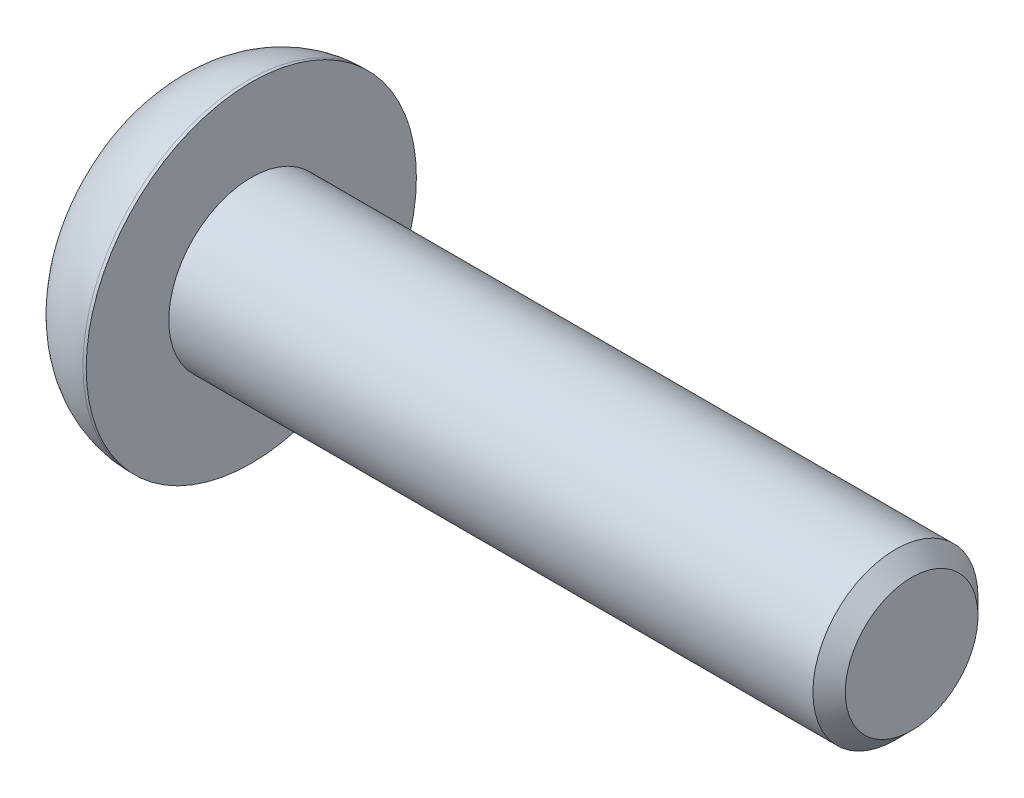
ISO-10303-21;
HEADER;
FILE_DESCRIPTION(('STEP AP214'),'2;1');
FILE_NAME('part.step','',(''),(''),'','','');
FILE_SCHEMA(('AUTOMOTIVE_DESIGN { 1 0 10303 214 1 1 1 1 }'));
ENDSEC;
DATA;
#1=APPLICATION_CONTEXT('core data for automotive mechanical design processes');
#2=APPLICATION_PROTOCOL_DEFINITION('international standard','automotive_design',2000,#1);
#3=PRODUCT_CONTEXT('',#1,'mechanical');
#4=PRODUCT('Part','Part','',(#3));
#5=PRODUCT_RELATED_PRODUCT_CATEGORY('part','',(#4));
#6=PRODUCT_DEFINITION_FORMATION('','',#4);
#7=PRODUCT_DEFINITION_CONTEXT('part definition',#1,'design');
#8=PRODUCT_DEFINITION('design','',#6,#7);
#9=PRODUCT_DEFINITION_SHAPE('','',#8);
#10=(LENGTH_UNIT() NAMED_UNIT(*) SI_UNIT(.MILLI.,.METRE.));
#11=(NAMED_UNIT(*) PLANE_ANGLE_UNIT() SI_UNIT($,.RADIAN.));
#12=(NAMED_UNIT(*) SI_UNIT($,.STERADIAN.) SOLID_ANGLE_UNIT());
#13=UNCERTAINTY_MEASURE_WITH_UNIT(LENGTH_MEASURE(1.E-05),#10,'distance_accuracy_value','');
#14=(GEOMETRIC_REPRESENTATION_CONTEXT(3) GLOBAL_UNCERTAINTY_ASSIGNED_CONTEXT((#13)) GLOBAL_UNIT_ASSIGNED_CONTEXT((#10,
#11,#12)) REPRESENTATION_CONTEXT('',''));
#15=CARTESIAN_POINT('',(0.,0.,0.));
#16=DIRECTION('',(0.,0.,1.));
#17=DIRECTION('',(1.,0.,0.));
#18=AXIS2_PLACEMENT_3D('',#15,#16,#17);
#19=CARTESIAN_POINT('',(1.93397459628386,0.,0.));
#20=DIRECTION('',(-1.,0.,0.));
#21=DIRECTION('',(0.,0.,1.));
#22=AXIS2_PLACEMENT_3D('',#19,#20,#21);
#23=CONICAL_SURFACE('',#22,1.499999999794,1.04719755099793);
#24=CARTESIAN_POINT('',(2.79999999995084,3.41060513164848E-10,0.));
#25=VERTEX_POINT('',#24);
#26=VERTEX_LOOP('',#25);
#27=FACE_BOUND('',#26,.T.);
#28=CARTESIAN_POINT('',(1.93397459621556,0.,0.));
#29=DIRECTION('',(1.,0.,0.));
#30=DIRECTION('',(0.,0.,-1.));
#31=AXIS2_PLACEMENT_3D('',#28,#29,#30);
#32=CIRCLE('',#31,1.5);
#33=CARTESIAN_POINT('',(1.93397459621556,0.,-1.5));
#34=VERTEX_POINT('',#33);
#35=EDGE_CURVE('E121',#34,#34,#32,.F.);
#36=ORIENTED_EDGE('',*,*,#35,.T.);
#37=EDGE_LOOP('',(#36));
#38=FACE_BOUND('',#37,.T.);
#39=ADVANCED_FACE('F17',(#27,#38),#23,.F.);
#40=CARTESIAN_POINT('',(0.966987298107781,0.,0.));
#41=DIRECTION('',(1.,0.,0.));
#42=DIRECTION('',(0.,0.,-1.));
#43=AXIS2_PLACEMENT_3D('',#40,#41,#42);
#44=CYLINDRICAL_SURFACE('',#43,1.5);
#45=ORIENTED_EDGE('',*,*,#35,.F.);
#46=EDGE_LOOP('',(#45));
#47=FACE_BOUND('',#46,.T.);
#48=CARTESIAN_POINT('',(1.82,0.,0.));
#49=DIRECTION('',(1.,0.,0.));
#50=DIRECTION('',(0.,0.,-1.));
#51=AXIS2_PLACEMENT_3D('',#48,#49,#50);
#52=CIRCLE('',#51,1.5);
#53=CARTESIAN_POINT('',(1.82,1.29903810567666,-0.75));
#54=VERTEX_POINT('',#53);
#55=CARTESIAN_POINT('',(1.82,1.29903810567666,0.749999999999999));
#56=VERTEX_POINT('',#55);
#57=EDGE_CURVE('E94',#54,#56,#52,.T.);
#58=ORIENTED_EDGE('',*,*,#57,.F.);
#59=CARTESIAN_POINT('',(1.82,0.,0.));
#60=DIRECTION('',(1.,0.,0.));
#61=DIRECTION('',(0.,0.,-1.));
#62=AXIS2_PLACEMENT_3D('',#59,#60,#61);
#63=CIRCLE('',#62,1.5);
#64=CARTESIAN_POINT('',(1.82,0.,-1.5));
#65=VERTEX_POINT('',#64);
#66=EDGE_CURVE('E102',#65,#54,#63,.T.);
#67=ORIENTED_EDGE('',*,*,#66,.F.);
#68=CARTESIAN_POINT('',(1.82,0.,0.));
#69=DIRECTION('',(1.,0.,0.));
#70=DIRECTION('',(0.,0.,-1.));
#71=AXIS2_PLACEMENT_3D('',#68,#69,#70);
#72=CIRCLE('',#71,1.5);
#73=CARTESIAN_POINT('',(1.82,-1.29903810567666,-0.749999999999999));
#74=VERTEX_POINT('',#73);
#75=EDGE_CURVE('E131',#65,#74,#72,.F.);
#76=ORIENTED_EDGE('',*,*,#75,.T.);
#77=CARTESIAN_POINT('',(1.82,0.,0.));
#78=DIRECTION('',(1.,0.,0.));
#79=DIRECTION('',(0.,0.,-1.));
#80=AXIS2_PLACEMENT_3D('',#77,#78,#79);
#81=CIRCLE('',#80,1.5);
#82=CARTESIAN_POINT('',(1.82,-1.29903810567666,0.750000000000001));
#83=VERTEX_POINT('',#82);
#84=EDGE_CURVE('E101',#74,#83,#81,.F.);
#85=ORIENTED_EDGE('',*,*,#84,.T.);
#86=CARTESIAN_POINT('',(1.82,0.,0.));
#87=DIRECTION('',(1.,0.,0.));
#88=DIRECTION('',(0.,0.,-1.));
#89=AXIS2_PLACEMENT_3D('',#86,#87,#88);
#90=CIRCLE('',#89,1.5);
#91=CARTESIAN_POINT('',(1.82,0.,1.5));
#92=VERTEX_POINT('',#91);
#93=EDGE_CURVE('E120',#92,#83,#90,.T.);
#94=ORIENTED_EDGE('',*,*,#93,.F.);
#95=CARTESIAN_POINT('',(1.82,0.,0.));
#96=DIRECTION('',(1.,0.,0.));
#97=DIRECTION('',(0.,0.,-1.));
#98=AXIS2_PLACEMENT_3D('',#95,#96,#97);
#99=CIRCLE('',#98,1.5);
#100=EDGE_CURVE('E20',#56,#92,#99,.T.);
#101=ORIENTED_EDGE('',*,*,#100,.F.);
#102=EDGE_LOOP('',(#58,#67,#76,#85,#94,#101));
#103=FACE_BOUND('',#102,.T.);
#104=ADVANCED_FACE('F118',(#47,#103),#44,.F.);
#105=CARTESIAN_POINT('',(1.82,0.,0.));
#106=DIRECTION('',(1.,0.,0.));
#107=DIRECTION('',(0.,0.,-1.));
#108=AXIS2_PLACEMENT_3D('',#105,#106,#107);
#109=PLANE('',#108);
#110=DIRECTION('',(0.,0.5,-0.866025403784439));
#111=VECTOR('',#110,1.);
#112=CARTESIAN_POINT('',(1.82,-0.866025403784439,-1.5));
#113=LINE('',#112,#111);
#114=CARTESIAN_POINT('',(1.82,-1.73205080756888,0.));
#115=VERTEX_POINT('',#114);
#116=EDGE_CURVE('E153',#74,#115,#113,.F.);
#117=ORIENTED_EDGE('',*,*,#116,.T.);
#118=DIRECTION('',(0.,-0.5,-0.866025403784439));
#119=VECTOR('',#118,1.);
#120=CARTESIAN_POINT('',(1.82,-1.73205080756888,0.));
#121=LINE('',#120,#119);
#122=EDGE_CURVE('E164',#115,#83,#121,.F.);
#123=ORIENTED_EDGE('',*,*,#122,.T.);
#124=ORIENTED_EDGE('',*,*,#84,.F.);
#125=EDGE_LOOP('',(#117,#123,#124));
#126=FACE_BOUND('',#125,.T.);
#127=ADVANCED_FACE('F415',(#126),#109,.F.);
#128=CARTESIAN_POINT('',(1.82,0.,0.));
#129=DIRECTION('',(1.,0.,0.));
#130=DIRECTION('',(0.,0.,-1.));
#131=AXIS2_PLACEMENT_3D('',#128,#129,#130);
#132=PLANE('',#131);
#133=DIRECTION('',(0.,1.,0.));
#134=VECTOR('',#133,1.);
#135=CARTESIAN_POINT('',(1.82,0.866025403784439,-1.5));
#136=LINE('',#135,#134);
#137=CARTESIAN_POINT('',(1.82,-0.866025403784439,-1.5));
#138=VERTEX_POINT('',#137);
#139=EDGE_CURVE('E174',#65,#138,#136,.F.);
#140=ORIENTED_EDGE('',*,*,#139,.T.);
#141=DIRECTION('',(0.,0.5,-0.866025403784439));
#142=VECTOR('',#141,1.);
#143=CARTESIAN_POINT('',(1.82,-0.866025403784439,-1.5));
#144=LINE('',#143,#142);
#145=EDGE_CURVE('E133',#138,#74,#144,.F.);
#146=ORIENTED_EDGE('',*,*,#145,.T.);
#147=ORIENTED_EDGE('',*,*,#75,.F.);
#148=EDGE_LOOP('',(#140,#146,#147));
#149=FACE_BOUND('',#148,.T.);
#150=ADVANCED_FACE('F405',(#149),#132,.F.);
#151=CARTESIAN_POINT('',(0.,-0.866025403784439,-1.5));
#152=DIRECTION('',(0.,-0.866025403784439,-0.5));
#153=DIRECTION('',(0.,0.5,-0.866025403784439));
#154=AXIS2_PLACEMENT_3D('',#151,#152,#153);
#155=PLANE('',#154);
#156=DIRECTION('',(1.,0.,0.));
#157=VECTOR('',#156,1.);
#158=CARTESIAN_POINT('',(0.,-1.73205080756888,0.));
#159=LINE('',#158,#157);
#160=CARTESIAN_POINT('',(0.,-1.73205080756888,0.));
#161=VERTEX_POINT('',#160);
#162=EDGE_CURVE('E159',#161,#115,#159,.T.);
#163=ORIENTED_EDGE('',*,*,#162,.T.);
#164=ORIENTED_EDGE('',*,*,#116,.F.);
#165=ORIENTED_EDGE('',*,*,#145,.F.);
#166=DIRECTION('',(-1.,0.,0.));
#167=VECTOR('',#166,1.);
#168=CARTESIAN_POINT('',(0.,-0.866025403784439,-1.5));
#169=LINE('',#168,#167);
#170=CARTESIAN_POINT('',(0.,-0.866025403784439,-1.5));
#171=VERTEX_POINT('',#170);
#172=EDGE_CURVE('E150',#138,#171,#169,.T.);
#173=ORIENTED_EDGE('',*,*,#172,.T.);
#174=DIRECTION('',(0.,0.5,-0.866025403784439));
#175=VECTOR('',#174,1.);
#176=CARTESIAN_POINT('',(0.,-0.866025403784439,-1.5));
#177=LINE('',#176,#175);
#178=EDGE_CURVE('E155',#161,#171,#177,.T.);
#179=ORIENTED_EDGE('',*,*,#178,.F.);
#180=EDGE_LOOP('',(#163,#164,#165,#173,#179));
#181=FACE_BOUND('',#180,.T.);
#182=ADVANCED_FACE('F395',(#181),#155,.F.);
#183=CARTESIAN_POINT('',(0.,-1.73205080756888,0.));
#184=DIRECTION('',(0.,-0.866025403784439,0.5));
#185=DIRECTION('',(0.,-0.5,-0.866025403784439));
#186=AXIS2_PLACEMENT_3D('',#183,#184,#185);
#187=PLANE('',#186);
#188=DIRECTION('',(1.,0.,0.));
#189=VECTOR('',#188,1.);
#190=CARTESIAN_POINT('',(0.,-0.866025403784439,1.5));
#191=LINE('',#190,#189);
#192=CARTESIAN_POINT('',(0.,-0.86602540378444,1.5));
#193=VERTEX_POINT('',#192);
#194=CARTESIAN_POINT('',(1.82,-0.866025403784439,1.5));
#195=VERTEX_POINT('',#194);
#196=EDGE_CURVE('E149',#193,#195,#191,.T.);
#197=ORIENTED_EDGE('',*,*,#196,.T.);
#198=DIRECTION('',(0.,-0.500000000000001,-0.866025403784438));
#199=VECTOR('',#198,1.);
#200=CARTESIAN_POINT('',(1.82,-0.866025403784439,1.5));
#201=LINE('',#200,#199);
#202=EDGE_CURVE('E187',#195,#83,#201,.T.);
#203=ORIENTED_EDGE('',*,*,#202,.T.);
#204=ORIENTED_EDGE('',*,*,#122,.F.);
#205=ORIENTED_EDGE('',*,*,#162,.F.);
#206=DIRECTION('',(0.,-0.5,-0.866025403784439));
#207=VECTOR('',#206,1.);
#208=CARTESIAN_POINT('',(0.,-1.73205080756888,0.));
#209=LINE('',#208,#207);
#210=EDGE_CURVE('E169',#193,#161,#209,.T.);
#211=ORIENTED_EDGE('',*,*,#210,.F.);
#212=EDGE_LOOP('',(#197,#203,#204,#205,#211));
#213=FACE_BOUND('',#212,.T.);
#214=ADVANCED_FACE('F386',(#213),#187,.F.);
#215=CARTESIAN_POINT('',(1.82,0.,0.));
#216=DIRECTION('',(1.,0.,0.));
#217=DIRECTION('',(0.,0.,-1.));
#218=AXIS2_PLACEMENT_3D('',#215,#216,#217);
#219=PLANE('',#218);
#220=ORIENTED_EDGE('',*,*,#202,.F.);
#221=DIRECTION('',(0.,1.,0.));
#222=VECTOR('',#221,1.);
#223=CARTESIAN_POINT('',(1.82,-0.866025403784439,1.5));
#224=LINE('',#223,#222);
#225=EDGE_CURVE('E194',#195,#92,#224,.T.);
#226=ORIENTED_EDGE('',*,*,#225,.T.);
#227=ORIENTED_EDGE('',*,*,#93,.T.);
#228=EDGE_LOOP('',(#220,#226,#227));
#229=FACE_BOUND('',#228,.T.);
#230=ADVANCED_FACE('F376',(#229),#219,.F.);
#231=CARTESIAN_POINT('',(1.82,0.,0.));
#232=DIRECTION('',(1.,0.,0.));
#233=DIRECTION('',(0.,0.,-1.));
#234=AXIS2_PLACEMENT_3D('',#231,#232,#233);
#235=PLANE('',#234);
#236=DIRECTION('',(0.,0.5,0.866025403784439));
#237=VECTOR('',#236,1.);
#238=CARTESIAN_POINT('',(1.82,1.73205080756888,0.));
#239=LINE('',#238,#237);
#240=CARTESIAN_POINT('',(1.82,0.866025403784441,-1.5));
#241=VERTEX_POINT('',#240);
#242=EDGE_CURVE('E204',#54,#241,#239,.F.);
#243=ORIENTED_EDGE('',*,*,#242,.T.);
#244=DIRECTION('',(0.,1.,0.));
#245=VECTOR('',#244,1.);
#246=CARTESIAN_POINT('',(1.82,0.866025403784439,-1.5));
#247=LINE('',#246,#245);
#248=EDGE_CURVE('E182',#241,#65,#247,.F.);
#249=ORIENTED_EDGE('',*,*,#248,.T.);
#250=ORIENTED_EDGE('',*,*,#66,.T.);
#251=EDGE_LOOP('',(#243,#249,#250));
#252=FACE_BOUND('',#251,.T.);
#253=ADVANCED_FACE('F366',(#252),#235,.F.);
#254=CARTESIAN_POINT('',(0.,0.866025403784439,-1.5));
#255=DIRECTION('',(0.,0.,-1.));
#256=DIRECTION('',(-1.,0.,0.));
#257=AXIS2_PLACEMENT_3D('',#254,#255,#256);
#258=PLANE('',#257);
#259=ORIENTED_EDGE('',*,*,#172,.F.);
#260=ORIENTED_EDGE('',*,*,#139,.F.);
#261=ORIENTED_EDGE('',*,*,#248,.F.);
#262=DIRECTION('',(1.,0.,0.));
#263=VECTOR('',#262,1.);
#264=CARTESIAN_POINT('',(0.,0.866025403784441,-1.5));
#265=LINE('',#264,#263);
#266=CARTESIAN_POINT('',(0.,0.86602540378444,-1.5));
#267=VERTEX_POINT('',#266);
#268=EDGE_CURVE('E201',#241,#267,#265,.F.);
#269=ORIENTED_EDGE('',*,*,#268,.T.);
#270=DIRECTION('',(0.,1.,0.));
#271=VECTOR('',#270,1.);
#272=CARTESIAN_POINT('',(0.,0.866025403784439,-1.5));
#273=LINE('',#272,#271);
#274=EDGE_CURVE('E147',#171,#267,#273,.T.);
#275=ORIENTED_EDGE('',*,*,#274,.F.);
#276=EDGE_LOOP('',(#259,#260,#261,#269,#275));
#277=FACE_BOUND('',#276,.T.);
#278=ADVANCED_FACE('F356',(#277),#258,.F.);
#279=CARTESIAN_POINT('',(0.,-0.866025403784439,1.5));
#280=DIRECTION('',(0.,0.,1.));
#281=DIRECTION('',(1.,0.,0.));
#282=AXIS2_PLACEMENT_3D('',#279,#280,#281);
#283=PLANE('',#282);
#284=DIRECTION('',(1.,0.,0.));
#285=VECTOR('',#284,1.);
#286=CARTESIAN_POINT('',(0.,0.866025403784439,1.5));
#287=LINE('',#286,#285);
#288=CARTESIAN_POINT('',(0.,0.866025403784439,1.5));
#289=VERTEX_POINT('',#288);
#290=CARTESIAN_POINT('',(1.82,0.866025403784439,1.5));
#291=VERTEX_POINT('',#290);
#292=EDGE_CURVE('E115',#289,#291,#287,.T.);
#293=ORIENTED_EDGE('',*,*,#292,.T.);
#294=DIRECTION('',(0.,1.,0.));
#295=VECTOR('',#294,1.);
#296=CARTESIAN_POINT('',(1.82,0.,1.5));
#297=LINE('',#296,#295);
#298=EDGE_CURVE('E114',#291,#92,#297,.F.);
#299=ORIENTED_EDGE('',*,*,#298,.T.);
#300=ORIENTED_EDGE('',*,*,#225,.F.);
#301=ORIENTED_EDGE('',*,*,#196,.F.);
#302=DIRECTION('',(0.,1.,0.));
#303=VECTOR('',#302,1.);
#304=CARTESIAN_POINT('',(0.,-0.866025403784439,1.5));
#305=LINE('',#304,#303);
#306=EDGE_CURVE('E198',#289,#193,#305,.F.);
#307=ORIENTED_EDGE('',*,*,#306,.F.);
#308=EDGE_LOOP('',(#293,#299,#300,#301,#307));
#309=FACE_BOUND('',#308,.T.);
#310=ADVANCED_FACE('F347',(#309),#283,.F.);
#311=CARTESIAN_POINT('',(1.82,0.,0.));
#312=DIRECTION('',(1.,0.,0.));
#313=DIRECTION('',(0.,0.,-1.));
#314=AXIS2_PLACEMENT_3D('',#311,#312,#313);
#315=PLANE('',#314);
#316=ORIENTED_EDGE('',*,*,#298,.F.);
#317=DIRECTION('',(0.,-0.5,0.866025403784439));
#318=VECTOR('',#317,1.);
#319=CARTESIAN_POINT('',(1.82,0.866025403784439,1.5));
#320=LINE('',#319,#318);
#321=EDGE_CURVE('E109',#291,#56,#320,.F.);
#322=ORIENTED_EDGE('',*,*,#321,.T.);
#323=ORIENTED_EDGE('',*,*,#100,.T.);
#324=EDGE_LOOP('',(#316,#322,#323));
#325=FACE_BOUND('',#324,.T.);
#326=ADVANCED_FACE('F113',(#325),#315,.F.);
#327=CARTESIAN_POINT('',(1.82,0.,0.));
#328=DIRECTION('',(1.,0.,0.));
#329=DIRECTION('',(0.,0.,-1.));
#330=AXIS2_PLACEMENT_3D('',#327,#328,#329);
#331=PLANE('',#330);
#332=DIRECTION('',(0.,-0.5,0.866025403784439));
#333=VECTOR('',#332,1.);
#334=CARTESIAN_POINT('',(1.82,0.866025403784439,1.5));
#335=LINE('',#334,#333);
#336=CARTESIAN_POINT('',(1.82,1.73205080756888,0.));
#337=VERTEX_POINT('',#336);
#338=EDGE_CURVE('E97',#56,#337,#335,.F.);
#339=ORIENTED_EDGE('',*,*,#338,.T.);
#340=DIRECTION('',(0.,0.5,0.866025403784439));
#341=VECTOR('',#340,1.);
#342=CARTESIAN_POINT('',(1.82,1.73205080756888,0.));
#343=LINE('',#342,#341);
#344=EDGE_CURVE('E99',#337,#54,#343,.F.);
#345=ORIENTED_EDGE('',*,*,#344,.T.);
#346=ORIENTED_EDGE('',*,*,#57,.T.);
#347=EDGE_LOOP('',(#339,#345,#346));
#348=FACE_BOUND('',#347,.T.);
#349=ADVANCED_FACE('F96',(#348),#331,.F.);
#350=CARTESIAN_POINT('',(0.,1.73205080756888,0.));
#351=DIRECTION('',(0.,0.866025403784439,-0.5));
#352=DIRECTION('',(0.,0.5,0.866025403784439));
#353=AXIS2_PLACEMENT_3D('',#350,#351,#352);
#354=PLANE('',#353);
#355=ORIENTED_EDGE('',*,*,#268,.F.);
#356=ORIENTED_EDGE('',*,*,#242,.F.);
#357=ORIENTED_EDGE('',*,*,#344,.F.);
#358=DIRECTION('',(1.,0.,0.));
#359=VECTOR('',#358,1.);
#360=CARTESIAN_POINT('',(0.,1.73205080756888,0.));
#361=LINE('',#360,#359);
#362=CARTESIAN_POINT('',(0.,1.73205080756888,0.));
#363=VERTEX_POINT('',#362);
#364=EDGE_CURVE('E111',#337,#363,#361,.F.);
#365=ORIENTED_EDGE('',*,*,#364,.T.);
#366=DIRECTION('',(0.,0.5,0.866025403784439));
#367=VECTOR('',#366,1.);
#368=CARTESIAN_POINT('',(0.,1.73205080756888,0.));
#369=LINE('',#368,#367);
#370=EDGE_CURVE('E35',#267,#363,#369,.T.);
#371=ORIENTED_EDGE('',*,*,#370,.F.);
#372=EDGE_LOOP('',(#355,#356,#357,#365,#371));
#373=FACE_BOUND('',#372,.T.);
#374=ADVANCED_FACE('F321',(#373),#354,.F.);
#375=CARTESIAN_POINT('',(0.,0.866025403784439,1.5));
#376=DIRECTION('',(0.,0.866025403784439,0.5));
#377=DIRECTION('',(0.,-0.5,0.866025403784439));
#378=AXIS2_PLACEMENT_3D('',#375,#376,#377);
#379=PLANE('',#378);
#380=ORIENTED_EDGE('',*,*,#364,.F.);
#381=ORIENTED_EDGE('',*,*,#338,.F.);
#382=ORIENTED_EDGE('',*,*,#321,.F.);
#383=ORIENTED_EDGE('',*,*,#292,.F.);
#384=DIRECTION('',(0.,-0.500000000000001,0.866025403784438));
#385=VECTOR('',#384,1.);
#386=CARTESIAN_POINT('',(0.,1.73205080756888,0.));
#387=LINE('',#386,#385);
#388=EDGE_CURVE('E138',#363,#289,#387,.T.);
#389=ORIENTED_EDGE('',*,*,#388,.F.);
#390=EDGE_LOOP('',(#380,#381,#382,#383,#389));
#391=FACE_BOUND('',#390,.T.);
#392=ADVANCED_FACE('F107',(#391),#379,.F.);
#393=CARTESIAN_POINT('',(0.,1.15,0.));
#394=DIRECTION('',(-1.,0.,0.));
#395=DIRECTION('',(0.,0.,1.));
#396=AXIS2_PLACEMENT_3D('',#393,#394,#395);
#397=PLANE('',#396);
#398=CARTESIAN_POINT('',(0.,0.,0.));
#399=DIRECTION('',(-1.,0.,0.));
#400=DIRECTION('',(0.,0.,1.));
#401=AXIS2_PLACEMENT_3D('',#398,#399,#400);
#402=CIRCLE('',#401,2.3);
#403=CARTESIAN_POINT('',(0.,0.,2.3));
#404=VERTEX_POINT('',#403);
#405=EDGE_CURVE('E134',#404,#404,#402,.F.);
#406=ORIENTED_EDGE('',*,*,#405,.F.);
#407=EDGE_LOOP('',(#406));
#408=FACE_BOUND('',#407,.T.);
#409=ORIENTED_EDGE('',*,*,#370,.T.);
#410=ORIENTED_EDGE('',*,*,#388,.T.);
#411=ORIENTED_EDGE('',*,*,#306,.T.);
#412=ORIENTED_EDGE('',*,*,#210,.T.);
#413=ORIENTED_EDGE('',*,*,#178,.T.);
#414=ORIENTED_EDGE('',*,*,#274,.T.);
#415=EDGE_LOOP('',(#409,#410,#411,#412,#413,#414));
#416=FACE_BOUND('',#415,.T.);
#417=ADVANCED_FACE('F302',(#408,#416),#397,.T.);
#418=CARTESIAN_POINT('',(2.7,0.,0.));
#419=DIRECTION('',(-1.,0.,0.));
#420=DIRECTION('',(0.,1.,0.));
#421=AXIS2_PLACEMENT_3D('',#418,#419,#420);
#422=DEGENERATE_TOROIDAL_SURFACE('',#421,2.3,2.7,.T.);
#423=ORIENTED_EDGE('',*,*,#405,.T.);
#424=EDGE_LOOP('',(#423));
#425=FACE_BOUND('',#424,.T.);
#426=CARTESIAN_POINT('',(2.7,0.,0.));
#427=DIRECTION('',(1.,0.,0.));
#428=DIRECTION('',(0.,0.,-1.));
#429=AXIS2_PLACEMENT_3D('',#426,#427,#428);
#430=CIRCLE('',#429,5.);
#431=CARTESIAN_POINT('',(2.7,0.,-5.));
#432=VERTEX_POINT('',#431);
#433=EDGE_CURVE('E137',#432,#432,#430,.T.);
#434=ORIENTED_EDGE('',*,*,#433,.F.);
#435=EDGE_LOOP('',(#434));
#436=FACE_BOUND('',#435,.T.);
#437=ADVANCED_FACE('F292',(#425,#436),#422,.T.);
#438=CARTESIAN_POINT('',(22.8,1.00475,0.));
#439=DIRECTION('',(1.,0.,0.));
#440=DIRECTION('',(0.,0.,-1.));
#441=AXIS2_PLACEMENT_3D('',#438,#439,#440);
#442=PLANE('',#441);
#443=CARTESIAN_POINT('',(22.8000000000179,0.,0.));
#444=DIRECTION('',(-1.,0.,0.));
#445=DIRECTION('',(0.,0.,1.));
#446=AXIS2_PLACEMENT_3D('',#443,#444,#445);
#447=CIRCLE('',#446,2.00949999998556);
#448=CARTESIAN_POINT('',(22.8000000000179,0.,2.00949999998556));
#449=VERTEX_POINT('',#448);
#450=EDGE_CURVE('E139',#449,#449,#447,.T.);
#451=ORIENTED_EDGE('',*,*,#450,.F.);
#452=EDGE_LOOP('',(#451));
#453=FACE_BOUND('',#452,.T.);
#454=ADVANCED_FACE('F257',(#453),#442,.T.);
#455=CARTESIAN_POINT('',(2.75,0.,0.));
#456=DIRECTION('',(1.,0.,0.));
#457=DIRECTION('',(0.,0.,-1.));
#458=AXIS2_PLACEMENT_3D('',#455,#456,#457);
#459=CYLINDRICAL_SURFACE('',#458,5.);
#460=ORIENTED_EDGE('',*,*,#433,.T.);
#461=EDGE_LOOP('',(#460));
#462=FACE_BOUND('',#461,.T.);
#463=CARTESIAN_POINT('',(2.8,0.,0.));
#464=DIRECTION('',(1.,0.,0.));
#465=DIRECTION('',(0.,0.,-1.));
#466=AXIS2_PLACEMENT_3D('',#463,#464,#465);
#467=CIRCLE('',#466,5.);
#468=CARTESIAN_POINT('',(2.8,0.,-5.));
#469=VERTEX_POINT('',#468);
#470=EDGE_CURVE('E142',#469,#469,#467,.T.);
#471=ORIENTED_EDGE('',*,*,#470,.F.);
#472=EDGE_LOOP('',(#471));
#473=FACE_BOUND('',#472,.T.);
#474=ADVANCED_FACE('F247',(#462,#473),#459,.T.);
#475=CARTESIAN_POINT('',(22.3095000000058,0.,0.));
#476=DIRECTION('',(-1.,0.,0.));
#477=DIRECTION('',(0.,0.,1.));
#478=AXIS2_PLACEMENT_3D('',#475,#476,#477);
#479=CONICAL_SURFACE('',#478,2.50000000005457,0.785398163455393);
#480=ORIENTED_EDGE('',*,*,#450,.T.);
#481=EDGE_LOOP('',(#480));
#482=FACE_BOUND('',#481,.T.);
#483=CARTESIAN_POINT('',(22.3095,0.,0.));
#484=DIRECTION('',(1.,0.,0.));
#485=DIRECTION('',(0.,0.,-1.));
#486=AXIS2_PLACEMENT_3D('',#483,#484,#485);
#487=CIRCLE('',#486,2.5);
#488=CARTESIAN_POINT('',(22.3095,0.,-2.5));
#489=VERTEX_POINT('',#488);
#490=EDGE_CURVE('E26',#489,#489,#487,.F.);
#491=ORIENTED_EDGE('',*,*,#490,.F.);
#492=EDGE_LOOP('',(#491));
#493=FACE_BOUND('',#492,.T.);
#494=ADVANCED_FACE('F244',(#482,#493),#479,.T.);
#495=CARTESIAN_POINT('',(2.8,3.75,0.));
#496=DIRECTION('',(1.,0.,0.));
#497=DIRECTION('',(0.,0.,-1.));
#498=AXIS2_PLACEMENT_3D('',#495,#496,#497);
#499=PLANE('',#498);
#500=CARTESIAN_POINT('',(2.8,0.,0.));
#501=DIRECTION('',(1.,0.,0.));
#502=DIRECTION('',(0.,0.,-1.));
#503=AXIS2_PLACEMENT_3D('',#500,#501,#502);
#504=CIRCLE('',#503,2.5);
#505=CARTESIAN_POINT('',(2.8,0.,-2.5));
#506=VERTEX_POINT('',#505);
#507=EDGE_CURVE('E11',#506,#506,#504,.T.);
#508=ORIENTED_EDGE('',*,*,#507,.F.);
#509=EDGE_LOOP('',(#508));
#510=FACE_BOUND('',#509,.T.);
#511=ORIENTED_EDGE('',*,*,#470,.T.);
#512=EDGE_LOOP('',(#511));
#513=FACE_BOUND('',#512,.T.);
#514=ADVANCED_FACE('F246',(#510,#513),#499,.T.);
#515=CARTESIAN_POINT('',(12.55475,0.,0.));
#516=DIRECTION('',(1.,0.,0.));
#517=DIRECTION('',(0.,0.,-1.));
#518=AXIS2_PLACEMENT_3D('',#515,#516,#517);
#519=CYLINDRICAL_SURFACE('',#518,2.5);
#520=ORIENTED_EDGE('',*,*,#490,.T.);
#521=EDGE_LOOP('',(#520));
#522=FACE_BOUND('',#521,.T.);
#523=ORIENTED_EDGE('',*,*,#507,.T.);
#524=EDGE_LOOP('',(#523));
#525=FACE_BOUND('',#524,.T.);
#526=ADVANCED_FACE('F241',(#522,#525),#519,.T.);
#527=CLOSED_SHELL('',(#39,#104,#127,#150,#182,#214,#230,#253,#278,#310,#326,#349,#374,#392,#417,
#437,#454,#474,#494,#514,#526));
#528=MANIFOLD_SOLID_BREP('B1',#527);
#529=ADVANCED_BREP_SHAPE_REPRESENTATION('',(#18,#528),#14);
#530=SHAPE_DEFINITION_REPRESENTATION(#9,#529);
ENDSEC;
END-ISO-10303-21;
